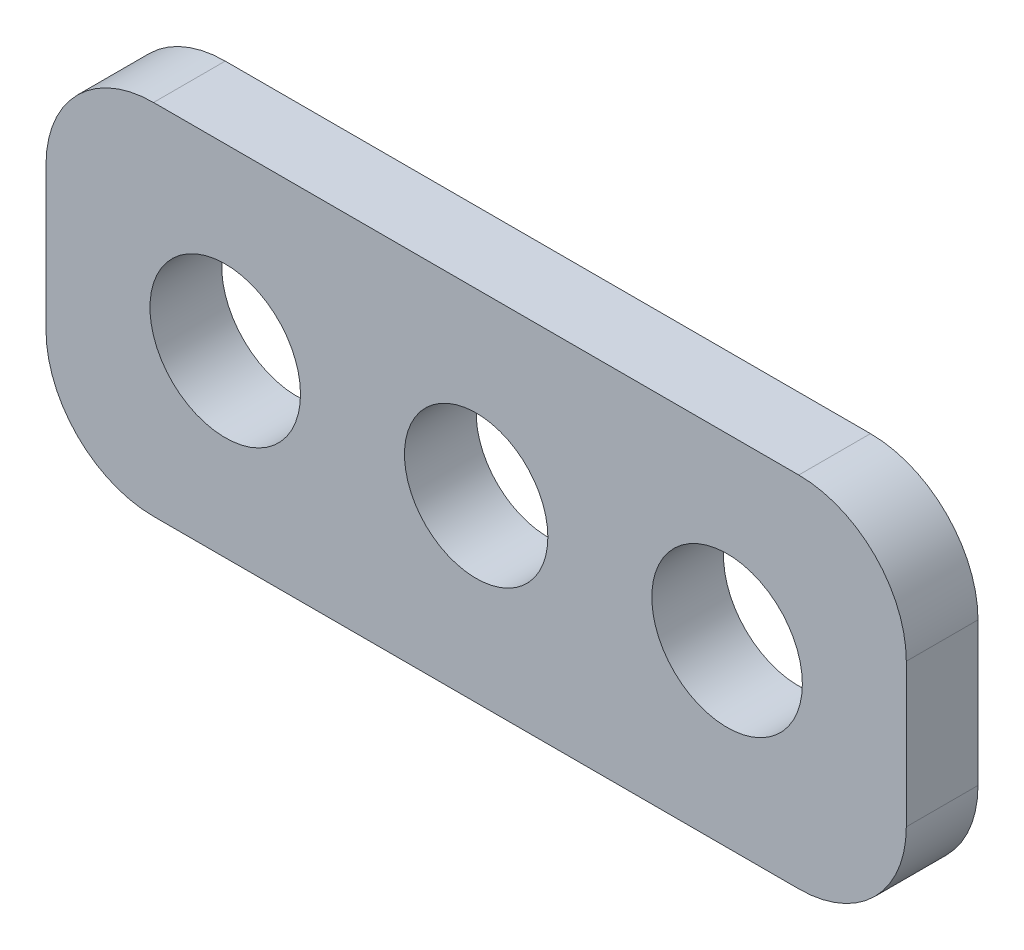
ISO-10303-21;
HEADER;
FILE_DESCRIPTION(('STEP AP214'),'2;1');
FILE_NAME('part.step','',(''),(''),'','','');
FILE_SCHEMA(('AUTOMOTIVE_DESIGN { 1 0 10303 214 1 1 1 1 }'));
ENDSEC;
DATA;
#1=APPLICATION_CONTEXT('core data for automotive mechanical design processes');
#2=APPLICATION_PROTOCOL_DEFINITION('international standard','automotive_design',2000,#1);
#3=PRODUCT_CONTEXT('',#1,'mechanical');
#4=PRODUCT('Part','Part','',(#3));
#5=PRODUCT_RELATED_PRODUCT_CATEGORY('part','',(#4));
#6=PRODUCT_DEFINITION_FORMATION('','',#4);
#7=PRODUCT_DEFINITION_CONTEXT('part definition',#1,'design');
#8=PRODUCT_DEFINITION('design','',#6,#7);
#9=PRODUCT_DEFINITION_SHAPE('','',#8);
#10=(LENGTH_UNIT() NAMED_UNIT(*) SI_UNIT(.MILLI.,.METRE.));
#11=(NAMED_UNIT(*) PLANE_ANGLE_UNIT() SI_UNIT($,.RADIAN.));
#12=(NAMED_UNIT(*) SI_UNIT($,.STERADIAN.) SOLID_ANGLE_UNIT());
#13=UNCERTAINTY_MEASURE_WITH_UNIT(LENGTH_MEASURE(1.E-05),#10,'distance_accuracy_value','');
#14=(GEOMETRIC_REPRESENTATION_CONTEXT(3) GLOBAL_UNCERTAINTY_ASSIGNED_CONTEXT((#13)) GLOBAL_UNIT_ASSIGNED_CONTEXT((#10,
#11,#12)) REPRESENTATION_CONTEXT('',''));
#15=CARTESIAN_POINT('',(0.,0.,0.));
#16=DIRECTION('',(0.,0.,1.));
#17=DIRECTION('',(1.,0.,0.));
#18=AXIS2_PLACEMENT_3D('',#15,#16,#17);
#19=CARTESIAN_POINT('',(-3.05,2.9,1.));
#20=DIRECTION('',(0.,0.,-1.));
#21=DIRECTION('',(-1.,0.,0.));
#22=AXIS2_PLACEMENT_3D('',#19,#20,#21);
#23=PLANE('',#22);
#24=CARTESIAN_POINT('',(-3.05,2.9,1.));
#25=DIRECTION('',(0.,0.,1.));
#26=DIRECTION('',(-1.,0.,0.));
#27=AXIS2_PLACEMENT_3D('',#24,#25,#26);
#28=CIRCLE('',#27,1.5);
#29=CARTESIAN_POINT('',(-4.55,2.9,1.));
#30=VERTEX_POINT('',#29);
#31=CARTESIAN_POINT('',(-3.05,1.4,1.));
#32=VERTEX_POINT('',#31);
#33=EDGE_CURVE('E144',#30,#32,#28,.T.);
#34=ORIENTED_EDGE('',*,*,#33,.T.);
#35=DIRECTION('',(1.,0.,0.));
#36=VECTOR('',#35,1.);
#37=CARTESIAN_POINT('',(-3.05,1.4,1.));
#38=LINE('',#37,#36);
#39=CARTESIAN_POINT('',(5.95,1.4,1.));
#40=VERTEX_POINT('',#39);
#41=EDGE_CURVE('E92',#32,#40,#38,.T.);
#42=ORIENTED_EDGE('',*,*,#41,.T.);
#43=CARTESIAN_POINT('',(5.95,2.9,1.));
#44=DIRECTION('',(0.,0.,1.));
#45=DIRECTION('',(1.,0.,0.));
#46=AXIS2_PLACEMENT_3D('',#43,#44,#45);
#47=CIRCLE('',#46,1.5);
#48=CARTESIAN_POINT('',(7.45,2.9,1.));
#49=VERTEX_POINT('',#48);
#50=EDGE_CURVE('E159',#40,#49,#47,.T.);
#51=ORIENTED_EDGE('',*,*,#50,.T.);
#52=DIRECTION('',(0.,1.,0.));
#53=VECTOR('',#52,1.);
#54=CARTESIAN_POINT('',(7.45,2.9,1.));
#55=LINE('',#54,#53);
#56=CARTESIAN_POINT('',(7.45,4.9,1.));
#57=VERTEX_POINT('',#56);
#58=EDGE_CURVE('E172',#49,#57,#55,.T.);
#59=ORIENTED_EDGE('',*,*,#58,.T.);
#60=CARTESIAN_POINT('',(5.95,4.9,1.));
#61=DIRECTION('',(0.,0.,1.));
#62=DIRECTION('',(-1.,0.,0.));
#63=AXIS2_PLACEMENT_3D('',#60,#61,#62);
#64=CIRCLE('',#63,1.5);
#65=CARTESIAN_POINT('',(5.95,6.4,1.));
#66=VERTEX_POINT('',#65);
#67=EDGE_CURVE('E111',#57,#66,#64,.T.);
#68=ORIENTED_EDGE('',*,*,#67,.T.);
#69=DIRECTION('',(-1.,0.,0.));
#70=VECTOR('',#69,1.);
#71=CARTESIAN_POINT('',(-3.05,6.4,1.));
#72=LINE('',#71,#70);
#73=CARTESIAN_POINT('',(-3.05,6.4,1.));
#74=VERTEX_POINT('',#73);
#75=EDGE_CURVE('E105',#66,#74,#72,.T.);
#76=ORIENTED_EDGE('',*,*,#75,.T.);
#77=CARTESIAN_POINT('',(-3.05,4.9,1.));
#78=DIRECTION('',(0.,0.,1.));
#79=DIRECTION('',(-1.,0.,0.));
#80=AXIS2_PLACEMENT_3D('',#77,#78,#79);
#81=CIRCLE('',#80,1.5);
#82=CARTESIAN_POINT('',(-4.55,4.9,1.));
#83=VERTEX_POINT('',#82);
#84=EDGE_CURVE('E109',#74,#83,#81,.T.);
#85=ORIENTED_EDGE('',*,*,#84,.T.);
#86=DIRECTION('',(0.,-1.,0.));
#87=VECTOR('',#86,1.);
#88=CARTESIAN_POINT('',(-4.55,2.9,1.));
#89=LINE('',#88,#87);
#90=EDGE_CURVE('E49',#83,#30,#89,.T.);
#91=ORIENTED_EDGE('',*,*,#90,.T.);
#92=EDGE_LOOP('',(#34,#42,#51,#59,#68,#76,#85,#91));
#93=FACE_BOUND('',#92,.T.);
#94=CARTESIAN_POINT('',(-2.05,3.9,1.));
#95=DIRECTION('',(0.,0.,1.));
#96=DIRECTION('',(1.,0.,0.));
#97=AXIS2_PLACEMENT_3D('',#94,#95,#96);
#98=CIRCLE('',#97,1.05);
#99=CARTESIAN_POINT('',(-1.,3.9,1.));
#100=VERTEX_POINT('',#99);
#101=EDGE_CURVE('E133',#100,#100,#98,.T.);
#102=ORIENTED_EDGE('',*,*,#101,.F.);
#103=EDGE_LOOP('',(#102));
#104=FACE_BOUND('',#103,.T.);
#105=CARTESIAN_POINT('',(4.95,3.9,1.));
#106=DIRECTION('',(0.,0.,1.));
#107=DIRECTION('',(1.,0.,0.));
#108=AXIS2_PLACEMENT_3D('',#105,#106,#107);
#109=CIRCLE('',#108,1.05);
#110=CARTESIAN_POINT('',(6.,3.9,1.));
#111=VERTEX_POINT('',#110);
#112=EDGE_CURVE('E181',#111,#111,#109,.T.);
#113=ORIENTED_EDGE('',*,*,#112,.F.);
#114=EDGE_LOOP('',(#113));
#115=FACE_BOUND('',#114,.T.);
#116=CARTESIAN_POINT('',(1.45,3.9,1.));
#117=DIRECTION('',(0.,0.,1.));
#118=DIRECTION('',(1.,0.,0.));
#119=AXIS2_PLACEMENT_3D('',#116,#117,#118);
#120=CIRCLE('',#119,1.);
#121=CARTESIAN_POINT('',(2.45,3.9,1.));
#122=VERTEX_POINT('',#121);
#123=EDGE_CURVE('E187',#122,#122,#120,.T.);
#124=ORIENTED_EDGE('',*,*,#123,.F.);
#125=EDGE_LOOP('',(#124));
#126=FACE_BOUND('',#125,.T.);
#127=ADVANCED_FACE('F32',(#93,#104,#115,#126),#23,.F.);
#128=CARTESIAN_POINT('',(-3.05,2.9,0.));
#129=DIRECTION('',(0.,0.,-1.));
#130=DIRECTION('',(-1.,0.,0.));
#131=AXIS2_PLACEMENT_3D('',#128,#129,#130);
#132=PLANE('',#131);
#133=CARTESIAN_POINT('',(4.95,3.9,0.));
#134=DIRECTION('',(0.,0.,1.));
#135=DIRECTION('',(1.,0.,0.));
#136=AXIS2_PLACEMENT_3D('',#133,#134,#135);
#137=CIRCLE('',#136,1.05);
#138=CARTESIAN_POINT('',(6.,3.9,0.));
#139=VERTEX_POINT('',#138);
#140=EDGE_CURVE('E184',#139,#139,#137,.T.);
#141=ORIENTED_EDGE('',*,*,#140,.T.);
#142=EDGE_LOOP('',(#141));
#143=FACE_BOUND('',#142,.T.);
#144=CARTESIAN_POINT('',(-3.05,2.9,0.));
#145=DIRECTION('',(0.,0.,1.));
#146=DIRECTION('',(-1.,0.,0.));
#147=AXIS2_PLACEMENT_3D('',#144,#145,#146);
#148=CIRCLE('',#147,1.5);
#149=CARTESIAN_POINT('',(-4.55,2.9,0.));
#150=VERTEX_POINT('',#149);
#151=CARTESIAN_POINT('',(-3.05,1.4,0.));
#152=VERTEX_POINT('',#151);
#153=EDGE_CURVE('E129',#150,#152,#148,.T.);
#154=ORIENTED_EDGE('',*,*,#153,.F.);
#155=DIRECTION('',(0.,-1.,0.));
#156=VECTOR('',#155,1.);
#157=CARTESIAN_POINT('',(-4.55,2.9,0.));
#158=LINE('',#157,#156);
#159=CARTESIAN_POINT('',(-4.55,4.9,0.));
#160=VERTEX_POINT('',#159);
#161=EDGE_CURVE('E84',#160,#150,#158,.T.);
#162=ORIENTED_EDGE('',*,*,#161,.F.);
#163=CARTESIAN_POINT('',(-3.05,4.9,0.));
#164=DIRECTION('',(0.,0.,1.));
#165=DIRECTION('',(-1.,0.,0.));
#166=AXIS2_PLACEMENT_3D('',#163,#164,#165);
#167=CIRCLE('',#166,1.5);
#168=CARTESIAN_POINT('',(-3.05,6.4,0.));
#169=VERTEX_POINT('',#168);
#170=EDGE_CURVE('E78',#169,#160,#167,.T.);
#171=ORIENTED_EDGE('',*,*,#170,.F.);
#172=DIRECTION('',(-1.,0.,0.));
#173=VECTOR('',#172,1.);
#174=CARTESIAN_POINT('',(-3.05,6.4,0.));
#175=LINE('',#174,#173);
#176=CARTESIAN_POINT('',(5.95,6.4,0.));
#177=VERTEX_POINT('',#176);
#178=EDGE_CURVE('E119',#177,#169,#175,.T.);
#179=ORIENTED_EDGE('',*,*,#178,.F.);
#180=CARTESIAN_POINT('',(5.95,4.9,0.));
#181=DIRECTION('',(0.,0.,1.));
#182=DIRECTION('',(-1.,0.,0.));
#183=AXIS2_PLACEMENT_3D('',#180,#181,#182);
#184=CIRCLE('',#183,1.5);
#185=CARTESIAN_POINT('',(7.45,4.9,0.));
#186=VERTEX_POINT('',#185);
#187=EDGE_CURVE('E139',#186,#177,#184,.T.);
#188=ORIENTED_EDGE('',*,*,#187,.F.);
#189=DIRECTION('',(0.,1.,0.));
#190=VECTOR('',#189,1.);
#191=CARTESIAN_POINT('',(7.45,2.9,0.));
#192=LINE('',#191,#190);
#193=CARTESIAN_POINT('',(7.45,2.9,0.));
#194=VERTEX_POINT('',#193);
#195=EDGE_CURVE('E137',#194,#186,#192,.T.);
#196=ORIENTED_EDGE('',*,*,#195,.F.);
#197=CARTESIAN_POINT('',(5.95,2.9,0.));
#198=DIRECTION('',(0.,0.,1.));
#199=DIRECTION('',(1.,0.,0.));
#200=AXIS2_PLACEMENT_3D('',#197,#198,#199);
#201=CIRCLE('',#200,1.5);
#202=CARTESIAN_POINT('',(5.95,1.4,0.));
#203=VERTEX_POINT('',#202);
#204=EDGE_CURVE('E135',#203,#194,#201,.T.);
#205=ORIENTED_EDGE('',*,*,#204,.F.);
#206=DIRECTION('',(1.,0.,0.));
#207=VECTOR('',#206,1.);
#208=CARTESIAN_POINT('',(-3.05,1.4,0.));
#209=LINE('',#208,#207);
#210=EDGE_CURVE('E132',#152,#203,#209,.T.);
#211=ORIENTED_EDGE('',*,*,#210,.F.);
#212=EDGE_LOOP('',(#154,#162,#171,#179,#188,#196,#205,#211));
#213=FACE_BOUND('',#212,.T.);
#214=CARTESIAN_POINT('',(-2.05,3.9,0.));
#215=DIRECTION('',(0.,0.,1.));
#216=DIRECTION('',(1.,0.,0.));
#217=AXIS2_PLACEMENT_3D('',#214,#215,#216);
#218=CIRCLE('',#217,1.05);
#219=CARTESIAN_POINT('',(-1.,3.9,0.));
#220=VERTEX_POINT('',#219);
#221=EDGE_CURVE('E178',#220,#220,#218,.T.);
#222=ORIENTED_EDGE('',*,*,#221,.T.);
#223=EDGE_LOOP('',(#222));
#224=FACE_BOUND('',#223,.T.);
#225=CARTESIAN_POINT('',(1.45,3.9,0.));
#226=DIRECTION('',(0.,0.,1.));
#227=DIRECTION('',(1.,0.,0.));
#228=AXIS2_PLACEMENT_3D('',#225,#226,#227);
#229=CIRCLE('',#228,1.);
#230=CARTESIAN_POINT('',(2.45,3.9,0.));
#231=VERTEX_POINT('',#230);
#232=EDGE_CURVE('E190',#231,#231,#229,.T.);
#233=ORIENTED_EDGE('',*,*,#232,.T.);
#234=EDGE_LOOP('',(#233));
#235=FACE_BOUND('',#234,.T.);
#236=ADVANCED_FACE('F163',(#143,#213,#224,#235),#132,.T.);
#237=CARTESIAN_POINT('',(-3.05,2.9,1.));
#238=DIRECTION('',(0.,0.,-1.));
#239=DIRECTION('',(-1.,0.,0.));
#240=AXIS2_PLACEMENT_3D('',#237,#238,#239);
#241=CYLINDRICAL_SURFACE('',#240,1.5);
#242=ORIENTED_EDGE('',*,*,#153,.T.);
#243=DIRECTION('',(0.,0.,-1.));
#244=VECTOR('',#243,1.);
#245=CARTESIAN_POINT('',(-3.05,1.4,1.));
#246=LINE('',#245,#244);
#247=EDGE_CURVE('E11',#32,#152,#246,.T.);
#248=ORIENTED_EDGE('',*,*,#247,.F.);
#249=ORIENTED_EDGE('',*,*,#33,.F.);
#250=DIRECTION('',(0.,0.,-1.));
#251=VECTOR('',#250,1.);
#252=CARTESIAN_POINT('',(-4.55,2.9,1.));
#253=LINE('',#252,#251);
#254=EDGE_CURVE('E125',#30,#150,#253,.T.);
#255=ORIENTED_EDGE('',*,*,#254,.T.);
#256=EDGE_LOOP('',(#242,#248,#249,#255));
#257=FACE_BOUND('',#256,.T.);
#258=ADVANCED_FACE('F34',(#257),#241,.T.);
#259=CARTESIAN_POINT('',(-3.05,1.4,1.));
#260=DIRECTION('',(0.,1.,0.));
#261=DIRECTION('',(0.,0.,1.));
#262=AXIS2_PLACEMENT_3D('',#259,#260,#261);
#263=PLANE('',#262);
#264=ORIENTED_EDGE('',*,*,#210,.T.);
#265=DIRECTION('',(0.,0.,-1.));
#266=VECTOR('',#265,1.);
#267=CARTESIAN_POINT('',(5.95,1.4,1.));
#268=LINE('',#267,#266);
#269=EDGE_CURVE('E41',#40,#203,#268,.T.);
#270=ORIENTED_EDGE('',*,*,#269,.F.);
#271=ORIENTED_EDGE('',*,*,#41,.F.);
#272=ORIENTED_EDGE('',*,*,#247,.T.);
#273=EDGE_LOOP('',(#264,#270,#271,#272));
#274=FACE_BOUND('',#273,.T.);
#275=ADVANCED_FACE('F222',(#274),#263,.F.);
#276=CARTESIAN_POINT('',(5.95,2.9,1.));
#277=DIRECTION('',(0.,0.,-1.));
#278=DIRECTION('',(-1.,0.,0.));
#279=AXIS2_PLACEMENT_3D('',#276,#277,#278);
#280=CYLINDRICAL_SURFACE('',#279,1.5);
#281=ORIENTED_EDGE('',*,*,#204,.T.);
#282=DIRECTION('',(0.,0.,-1.));
#283=VECTOR('',#282,1.);
#284=CARTESIAN_POINT('',(7.45,2.9,1.));
#285=LINE('',#284,#283);
#286=EDGE_CURVE('E151',#49,#194,#285,.T.);
#287=ORIENTED_EDGE('',*,*,#286,.F.);
#288=ORIENTED_EDGE('',*,*,#50,.F.);
#289=ORIENTED_EDGE('',*,*,#269,.T.);
#290=EDGE_LOOP('',(#281,#287,#288,#289));
#291=FACE_BOUND('',#290,.T.);
#292=ADVANCED_FACE('F157',(#291),#280,.T.);
#293=CARTESIAN_POINT('',(7.45,2.9,1.));
#294=DIRECTION('',(-1.,0.,0.));
#295=DIRECTION('',(0.,0.,1.));
#296=AXIS2_PLACEMENT_3D('',#293,#294,#295);
#297=PLANE('',#296);
#298=ORIENTED_EDGE('',*,*,#195,.T.);
#299=DIRECTION('',(0.,0.,-1.));
#300=VECTOR('',#299,1.);
#301=CARTESIAN_POINT('',(7.45,4.9,1.));
#302=LINE('',#301,#300);
#303=EDGE_CURVE('E148',#57,#186,#302,.T.);
#304=ORIENTED_EDGE('',*,*,#303,.F.);
#305=ORIENTED_EDGE('',*,*,#58,.F.);
#306=ORIENTED_EDGE('',*,*,#286,.T.);
#307=EDGE_LOOP('',(#298,#304,#305,#306));
#308=FACE_BOUND('',#307,.T.);
#309=ADVANCED_FACE('F168',(#308),#297,.F.);
#310=CARTESIAN_POINT('',(5.95,4.9,1.));
#311=DIRECTION('',(0.,0.,-1.));
#312=DIRECTION('',(-1.,0.,0.));
#313=AXIS2_PLACEMENT_3D('',#310,#311,#312);
#314=CYLINDRICAL_SURFACE('',#313,1.5);
#315=ORIENTED_EDGE('',*,*,#187,.T.);
#316=DIRECTION('',(0.,0.,-1.));
#317=VECTOR('',#316,1.);
#318=CARTESIAN_POINT('',(5.95,6.4,1.));
#319=LINE('',#318,#317);
#320=EDGE_CURVE('E120',#66,#177,#319,.T.);
#321=ORIENTED_EDGE('',*,*,#320,.F.);
#322=ORIENTED_EDGE('',*,*,#67,.F.);
#323=ORIENTED_EDGE('',*,*,#303,.T.);
#324=EDGE_LOOP('',(#315,#321,#322,#323));
#325=FACE_BOUND('',#324,.T.);
#326=ADVANCED_FACE('F171',(#325),#314,.T.);
#327=CARTESIAN_POINT('',(-3.05,6.4,1.));
#328=DIRECTION('',(0.,-1.,0.));
#329=DIRECTION('',(0.,0.,-1.));
#330=AXIS2_PLACEMENT_3D('',#327,#328,#329);
#331=PLANE('',#330);
#332=ORIENTED_EDGE('',*,*,#178,.T.);
#333=DIRECTION('',(0.,0.,-1.));
#334=VECTOR('',#333,1.);
#335=CARTESIAN_POINT('',(-3.05,6.4,1.));
#336=LINE('',#335,#334);
#337=EDGE_CURVE('E116',#74,#169,#336,.T.);
#338=ORIENTED_EDGE('',*,*,#337,.F.);
#339=ORIENTED_EDGE('',*,*,#75,.F.);
#340=ORIENTED_EDGE('',*,*,#320,.T.);
#341=EDGE_LOOP('',(#332,#338,#339,#340));
#342=FACE_BOUND('',#341,.T.);
#343=ADVANCED_FACE('F117',(#342),#331,.F.);
#344=CARTESIAN_POINT('',(-3.05,4.9,1.));
#345=DIRECTION('',(0.,0.,-1.));
#346=DIRECTION('',(-1.,0.,0.));
#347=AXIS2_PLACEMENT_3D('',#344,#345,#346);
#348=CYLINDRICAL_SURFACE('',#347,1.5);
#349=ORIENTED_EDGE('',*,*,#170,.T.);
#350=DIRECTION('',(0.,0.,-1.));
#351=VECTOR('',#350,1.);
#352=CARTESIAN_POINT('',(-4.55,4.9,1.));
#353=LINE('',#352,#351);
#354=EDGE_CURVE('E121',#83,#160,#353,.T.);
#355=ORIENTED_EDGE('',*,*,#354,.F.);
#356=ORIENTED_EDGE('',*,*,#84,.F.);
#357=ORIENTED_EDGE('',*,*,#337,.T.);
#358=EDGE_LOOP('',(#349,#355,#356,#357));
#359=FACE_BOUND('',#358,.T.);
#360=ADVANCED_FACE('F123',(#359),#348,.T.);
#361=CARTESIAN_POINT('',(-4.55,2.9,1.));
#362=DIRECTION('',(1.,0.,0.));
#363=DIRECTION('',(0.,1.,0.));
#364=AXIS2_PLACEMENT_3D('',#361,#362,#363);
#365=PLANE('',#364);
#366=ORIENTED_EDGE('',*,*,#161,.T.);
#367=ORIENTED_EDGE('',*,*,#254,.F.);
#368=ORIENTED_EDGE('',*,*,#90,.F.);
#369=ORIENTED_EDGE('',*,*,#354,.T.);
#370=EDGE_LOOP('',(#366,#367,#368,#369));
#371=FACE_BOUND('',#370,.T.);
#372=ADVANCED_FACE('F210',(#371),#365,.F.);
#373=CARTESIAN_POINT('',(-2.05,3.9,1.));
#374=DIRECTION('',(0.,0.,-1.));
#375=DIRECTION('',(-1.,0.,0.));
#376=AXIS2_PLACEMENT_3D('',#373,#374,#375);
#377=CYLINDRICAL_SURFACE('',#376,1.05);
#378=ORIENTED_EDGE('',*,*,#101,.T.);
#379=EDGE_LOOP('',(#378));
#380=FACE_BOUND('',#379,.T.);
#381=ORIENTED_EDGE('',*,*,#221,.F.);
#382=EDGE_LOOP('',(#381));
#383=FACE_BOUND('',#382,.T.);
#384=ADVANCED_FACE('F207',(#380,#383),#377,.F.);
#385=CARTESIAN_POINT('',(4.95,3.9,1.));
#386=DIRECTION('',(0.,0.,-1.));
#387=DIRECTION('',(-1.,0.,0.));
#388=AXIS2_PLACEMENT_3D('',#385,#386,#387);
#389=CYLINDRICAL_SURFACE('',#388,1.05);
#390=ORIENTED_EDGE('',*,*,#112,.T.);
#391=EDGE_LOOP('',(#390));
#392=FACE_BOUND('',#391,.T.);
#393=ORIENTED_EDGE('',*,*,#140,.F.);
#394=EDGE_LOOP('',(#393));
#395=FACE_BOUND('',#394,.T.);
#396=ADVANCED_FACE('F286',(#392,#395),#389,.F.);
#397=CARTESIAN_POINT('',(1.45,3.9,1.));
#398=DIRECTION('',(0.,0.,-1.));
#399=DIRECTION('',(-1.,0.,0.));
#400=AXIS2_PLACEMENT_3D('',#397,#398,#399);
#401=CYLINDRICAL_SURFACE('',#400,1.);
#402=ORIENTED_EDGE('',*,*,#123,.T.);
#403=EDGE_LOOP('',(#402));
#404=FACE_BOUND('',#403,.T.);
#405=ORIENTED_EDGE('',*,*,#232,.F.);
#406=EDGE_LOOP('',(#405));
#407=FACE_BOUND('',#406,.T.);
#408=ADVANCED_FACE('F196',(#404,#407),#401,.F.);
#409=CLOSED_SHELL('',(#127,#236,#258,#275,#292,#309,#326,#343,#360,#372,#384,#396,#408));
#410=MANIFOLD_SOLID_BREP('B2',#409);
#411=ADVANCED_BREP_SHAPE_REPRESENTATION('',(#18,#410),#14);
#412=SHAPE_DEFINITION_REPRESENTATION(#9,#411);
ENDSEC;
END-ISO-10303-21;
